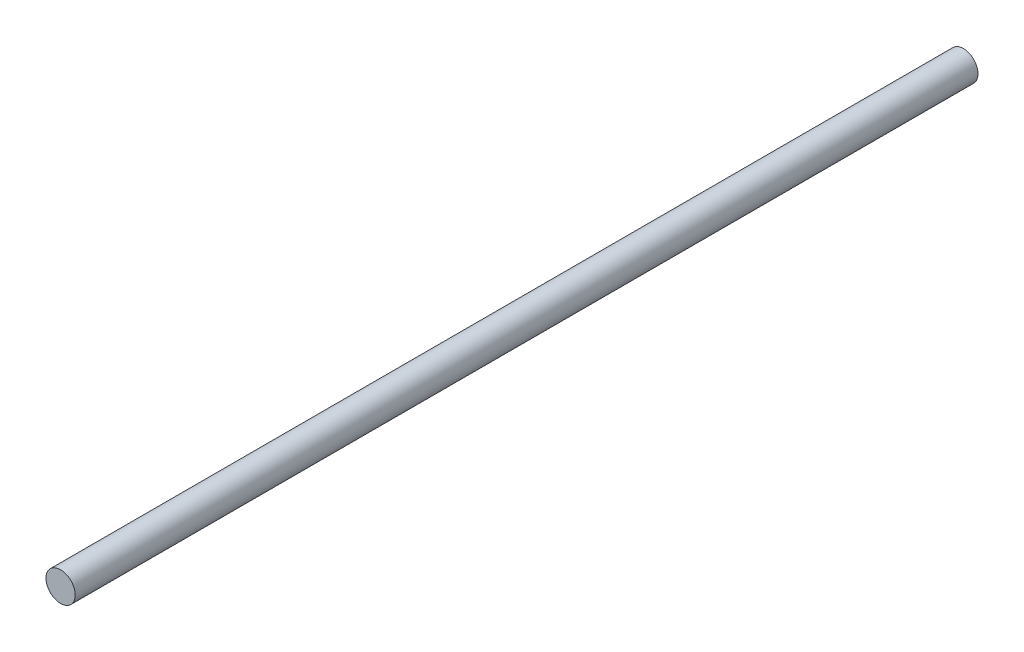
ISO-10303-21;
HEADER;
FILE_DESCRIPTION(('STEP AP214'),'2;1');
FILE_NAME('part.step','',(''),(''),'','','');
FILE_SCHEMA(('AUTOMOTIVE_DESIGN { 1 0 10303 214 1 1 1 1 }'));
ENDSEC;
DATA;
#1=APPLICATION_CONTEXT('core data for automotive mechanical design processes');
#2=APPLICATION_PROTOCOL_DEFINITION('international standard','automotive_design',2000,#1);
#3=PRODUCT_CONTEXT('',#1,'mechanical');
#4=PRODUCT('Part','Part','',(#3));
#5=PRODUCT_RELATED_PRODUCT_CATEGORY('part','',(#4));
#6=PRODUCT_DEFINITION_FORMATION('','',#4);
#7=PRODUCT_DEFINITION_CONTEXT('part definition',#1,'design');
#8=PRODUCT_DEFINITION('design','',#6,#7);
#9=PRODUCT_DEFINITION_SHAPE('','',#8);
#10=(LENGTH_UNIT() NAMED_UNIT(*) SI_UNIT(.MILLI.,.METRE.));
#11=(NAMED_UNIT(*) PLANE_ANGLE_UNIT() SI_UNIT($,.RADIAN.));
#12=(NAMED_UNIT(*) SI_UNIT($,.STERADIAN.) SOLID_ANGLE_UNIT());
#13=UNCERTAINTY_MEASURE_WITH_UNIT(LENGTH_MEASURE(1.E-05),#10,'distance_accuracy_value','');
#14=(GEOMETRIC_REPRESENTATION_CONTEXT(3) GLOBAL_UNCERTAINTY_ASSIGNED_CONTEXT((#13)) GLOBAL_UNIT_ASSIGNED_CONTEXT((#10,
#11,#12)) REPRESENTATION_CONTEXT('',''));
#15=CARTESIAN_POINT('',(0.,0.,0.));
#16=DIRECTION('',(0.,0.,1.));
#17=DIRECTION('',(1.,0.,0.));
#18=AXIS2_PLACEMENT_3D('',#15,#16,#17);
#19=CARTESIAN_POINT('',(0.,0.,196.));
#20=DIRECTION('',(0.,0.,-1.));
#21=DIRECTION('',(-1.,0.,0.));
#22=AXIS2_PLACEMENT_3D('',#19,#20,#21);
#23=CYLINDRICAL_SURFACE('',#22,3.175);
#24=CARTESIAN_POINT('',(0.,0.,196.));
#25=DIRECTION('',(0.,0.,1.));
#26=DIRECTION('',(1.,0.,0.));
#27=AXIS2_PLACEMENT_3D('',#24,#25,#26);
#28=CIRCLE('',#27,3.175);
#29=CARTESIAN_POINT('',(3.175,0.,196.));
#30=VERTEX_POINT('',#29);
#31=EDGE_CURVE('E10',#30,#30,#28,.T.);
#32=ORIENTED_EDGE('',*,*,#31,.F.);
#33=EDGE_LOOP('',(#32));
#34=FACE_BOUND('',#33,.T.);
#35=CARTESIAN_POINT('',(0.,0.,0.));
#36=DIRECTION('',(0.,0.,1.));
#37=DIRECTION('',(1.,0.,0.));
#38=AXIS2_PLACEMENT_3D('',#35,#36,#37);
#39=CIRCLE('',#38,3.175);
#40=CARTESIAN_POINT('',(3.175,0.,0.));
#41=VERTEX_POINT('',#40);
#42=EDGE_CURVE('E42',#41,#41,#39,.T.);
#43=ORIENTED_EDGE('',*,*,#42,.T.);
#44=EDGE_LOOP('',(#43));
#45=FACE_BOUND('',#44,.T.);
#46=ADVANCED_FACE('F41',(#34,#45),#23,.T.);
#47=CARTESIAN_POINT('',(0.,0.,196.));
#48=DIRECTION('',(0.,0.,1.));
#49=DIRECTION('',(1.,0.,0.));
#50=AXIS2_PLACEMENT_3D('',#47,#48,#49);
#51=PLANE('',#50);
#52=ORIENTED_EDGE('',*,*,#31,.T.);
#53=EDGE_LOOP('',(#52));
#54=FACE_BOUND('',#53,.T.);
#55=ADVANCED_FACE('F57',(#54),#51,.T.);
#56=CARTESIAN_POINT('',(0.,0.,0.));
#57=DIRECTION('',(0.,0.,1.));
#58=DIRECTION('',(1.,0.,0.));
#59=AXIS2_PLACEMENT_3D('',#56,#57,#58);
#60=PLANE('',#59);
#61=ORIENTED_EDGE('',*,*,#42,.F.);
#62=EDGE_LOOP('',(#61));
#63=FACE_BOUND('',#62,.T.);
#64=ADVANCED_FACE('F53',(#63),#60,.F.);
#65=CLOSED_SHELL('',(#46,#55,#64));
#66=MANIFOLD_SOLID_BREP('B2',#65);
#67=ADVANCED_BREP_SHAPE_REPRESENTATION('',(#18,#66),#14);
#68=SHAPE_DEFINITION_REPRESENTATION(#9,#67);
ENDSEC;
END-ISO-10303-21;
